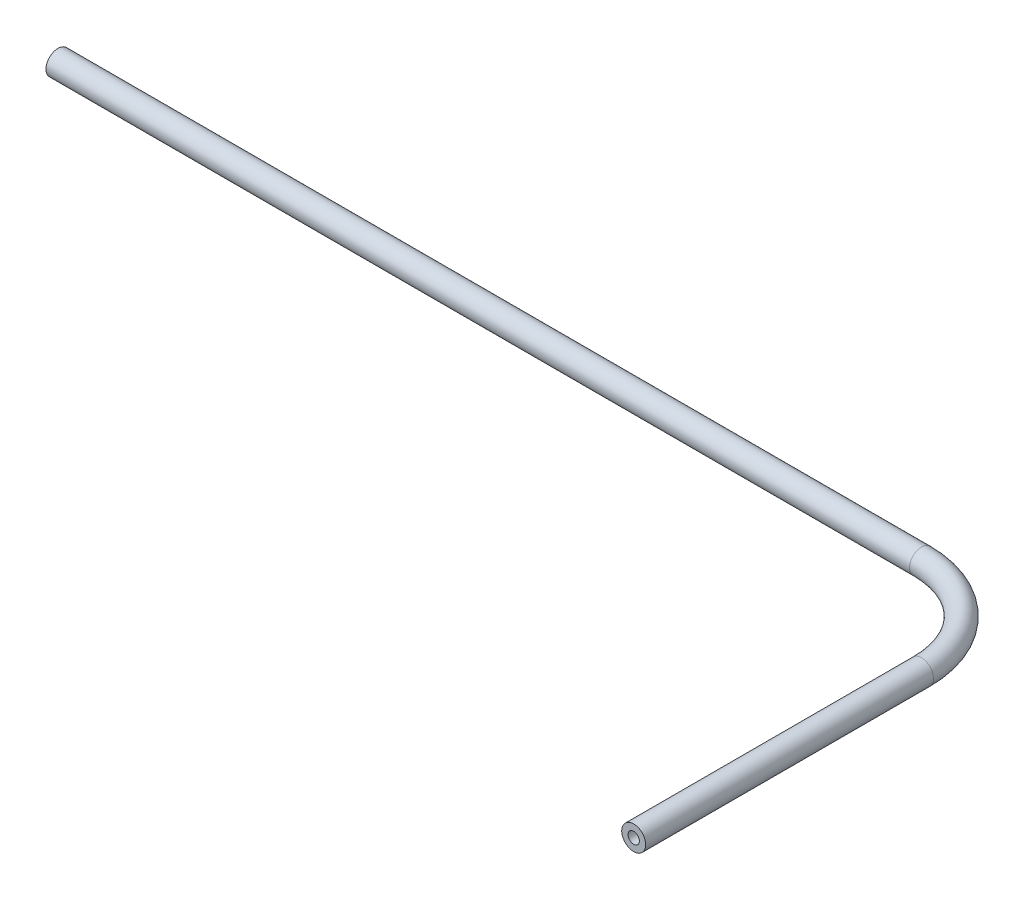
ISO-10303-21;
HEADER;
FILE_DESCRIPTION(('STEP AP214'),'2;1');
FILE_NAME('part.step','',(''),(''),'','','');
FILE_SCHEMA(('AUTOMOTIVE_DESIGN { 1 0 10303 214 1 1 1 1 }'));
ENDSEC;
DATA;
#1=APPLICATION_CONTEXT('core data for automotive mechanical design processes');
#2=APPLICATION_PROTOCOL_DEFINITION('international standard','automotive_design',2000,#1);
#3=PRODUCT_CONTEXT('',#1,'mechanical');
#4=PRODUCT('Part','Part','',(#3));
#5=PRODUCT_RELATED_PRODUCT_CATEGORY('part','',(#4));
#6=PRODUCT_DEFINITION_FORMATION('','',#4);
#7=PRODUCT_DEFINITION_CONTEXT('part definition',#1,'design');
#8=PRODUCT_DEFINITION('design','',#6,#7);
#9=PRODUCT_DEFINITION_SHAPE('','',#8);
#10=(LENGTH_UNIT() NAMED_UNIT(*) SI_UNIT(.MILLI.,.METRE.));
#11=(NAMED_UNIT(*) PLANE_ANGLE_UNIT() SI_UNIT($,.RADIAN.));
#12=(NAMED_UNIT(*) SI_UNIT($,.STERADIAN.) SOLID_ANGLE_UNIT());
#13=UNCERTAINTY_MEASURE_WITH_UNIT(LENGTH_MEASURE(1.E-05),#10,'distance_accuracy_value','');
#14=(GEOMETRIC_REPRESENTATION_CONTEXT(3) GLOBAL_UNCERTAINTY_ASSIGNED_CONTEXT((#13)) GLOBAL_UNIT_ASSIGNED_CONTEXT((#10,
#11,#12)) REPRESENTATION_CONTEXT('',''));
#15=CARTESIAN_POINT('',(0.,0.,0.));
#16=DIRECTION('',(0.,0.,1.));
#17=DIRECTION('',(1.,0.,0.));
#18=AXIS2_PLACEMENT_3D('',#15,#16,#17);
#19=CARTESIAN_POINT('',(-254.,0.,0.));
#20=DIRECTION('',(1.,0.,0.));
#21=DIRECTION('',(0.,0.,-1.));
#22=AXIS2_PLACEMENT_3D('',#19,#20,#21);
#23=CYLINDRICAL_SURFACE('',#22,3.175);
#24=CARTESIAN_POINT('',(-25.4,0.,0.));
#25=DIRECTION('',(1.,0.,0.));
#26=DIRECTION('',(0.,0.,-1.));
#27=AXIS2_PLACEMENT_3D('',#24,#25,#26);
#28=CIRCLE('',#27,3.175);
#29=CARTESIAN_POINT('',(-25.4,0.,-3.17500000000004));
#30=VERTEX_POINT('',#29);
#31=EDGE_CURVE('E64',#30,#30,#28,.T.);
#32=ORIENTED_EDGE('',*,*,#31,.F.);
#33=EDGE_LOOP('',(#32));
#34=FACE_BOUND('',#33,.T.);
#35=CARTESIAN_POINT('',(-254.,0.,0.));
#36=DIRECTION('',(1.,0.,0.));
#37=DIRECTION('',(0.,0.,-1.));
#38=AXIS2_PLACEMENT_3D('',#35,#36,#37);
#39=CIRCLE('',#38,3.175);
#40=CARTESIAN_POINT('',(-254.,0.,-3.175));
#41=VERTEX_POINT('',#40);
#42=EDGE_CURVE('E61',#41,#41,#39,.T.);
#43=ORIENTED_EDGE('',*,*,#42,.T.);
#44=EDGE_LOOP('',(#43));
#45=FACE_BOUND('',#44,.T.);
#46=ADVANCED_FACE('F37',(#34,#45),#23,.T.);
#47=CARTESIAN_POINT('',(-25.4,0.,25.4));
#48=DIRECTION('',(0.,-1.,0.));
#49=DIRECTION('',(0.,0.,-1.));
#50=AXIS2_PLACEMENT_3D('',#47,#48,#49);
#51=TOROIDAL_SURFACE('',#50,25.4,3.175);
#52=CARTESIAN_POINT('',(0.,0.,25.4));
#53=DIRECTION('',(0.,0.,1.));
#54=DIRECTION('',(1.,0.,0.));
#55=AXIS2_PLACEMENT_3D('',#52,#53,#54);
#56=CIRCLE('',#55,3.175);
#57=CARTESIAN_POINT('',(3.17500000000003,0.,25.4));
#58=VERTEX_POINT('',#57);
#59=EDGE_CURVE('E41',#58,#58,#56,.T.);
#60=CARTESIAN_POINT('',(-25.4,0.,25.4));
#61=DIRECTION('',(0.,-1.,0.));
#62=DIRECTION('',(0.,0.,-1.));
#63=AXIS2_PLACEMENT_3D('',#60,#61,#62);
#64=CIRCLE('',#63,28.575);
#65=EDGE_CURVE('',#30,#58,#64,.T.);
#66=ORIENTED_EDGE('',*,*,#31,.T.);
#67=ORIENTED_EDGE('',*,*,#59,.F.);
#68=ORIENTED_EDGE('',*,*,#65,.T.);
#69=ORIENTED_EDGE('',*,*,#65,.F.);
#70=EDGE_LOOP('',(#66,#68,#67,#69));
#71=FACE_BOUND('',#70,.T.);
#72=ADVANCED_FACE('F74',(#71),#51,.T.);
#73=CARTESIAN_POINT('',(0.,0.,25.4));
#74=DIRECTION('',(0.,0.,1.));
#75=DIRECTION('',(1.,0.,0.));
#76=AXIS2_PLACEMENT_3D('',#73,#74,#75);
#77=CYLINDRICAL_SURFACE('',#76,3.175);
#78=CARTESIAN_POINT('',(0.,0.,101.6));
#79=DIRECTION('',(0.,0.,1.));
#80=DIRECTION('',(1.,0.,0.));
#81=AXIS2_PLACEMENT_3D('',#78,#79,#80);
#82=CIRCLE('',#81,3.175);
#83=CARTESIAN_POINT('',(3.17500000000001,0.,101.6));
#84=VERTEX_POINT('',#83);
#85=EDGE_CURVE('E56',#84,#84,#82,.T.);
#86=ORIENTED_EDGE('',*,*,#85,.F.);
#87=EDGE_LOOP('',(#86));
#88=FACE_BOUND('',#87,.T.);
#89=ORIENTED_EDGE('',*,*,#59,.T.);
#90=EDGE_LOOP('',(#89));
#91=FACE_BOUND('',#90,.T.);
#92=ADVANCED_FACE('F39',(#88,#91),#77,.T.);
#93=CARTESIAN_POINT('',(-254.,0.,0.));
#94=DIRECTION('',(1.,0.,0.));
#95=DIRECTION('',(0.,0.,-1.));
#96=AXIS2_PLACEMENT_3D('',#93,#94,#95);
#97=PLANE('',#96);
#98=CARTESIAN_POINT('',(-254.,0.,0.));
#99=DIRECTION('',(1.,0.,0.));
#100=DIRECTION('',(0.,0.,-1.));
#101=AXIS2_PLACEMENT_3D('',#98,#99,#100);
#102=CIRCLE('',#101,1.5);
#103=CARTESIAN_POINT('',(-254.,0.,-1.5));
#104=VERTEX_POINT('',#103);
#105=EDGE_CURVE('E60',#104,#104,#102,.F.);
#106=ORIENTED_EDGE('',*,*,#105,.F.);
#107=EDGE_LOOP('',(#106));
#108=FACE_BOUND('',#107,.T.);
#109=ORIENTED_EDGE('',*,*,#42,.F.);
#110=EDGE_LOOP('',(#109));
#111=FACE_BOUND('',#110,.T.);
#112=ADVANCED_FACE('F80',(#108,#111),#97,.F.);
#113=CARTESIAN_POINT('',(0.,0.,101.6));
#114=DIRECTION('',(0.,0.,1.));
#115=DIRECTION('',(1.,0.,0.));
#116=AXIS2_PLACEMENT_3D('',#113,#114,#115);
#117=PLANE('',#116);
#118=CARTESIAN_POINT('',(0.,0.,101.6));
#119=DIRECTION('',(0.,0.,1.));
#120=DIRECTION('',(1.,0.,0.));
#121=AXIS2_PLACEMENT_3D('',#118,#119,#120);
#122=CIRCLE('',#121,1.5);
#123=CARTESIAN_POINT('',(1.50000000000001,0.,101.6));
#124=VERTEX_POINT('',#123);
#125=EDGE_CURVE('E10',#124,#124,#122,.F.);
#126=ORIENTED_EDGE('',*,*,#125,.T.);
#127=EDGE_LOOP('',(#126));
#128=FACE_BOUND('',#127,.T.);
#129=ORIENTED_EDGE('',*,*,#85,.T.);
#130=EDGE_LOOP('',(#129));
#131=FACE_BOUND('',#130,.T.);
#132=ADVANCED_FACE('F98',(#128,#131),#117,.T.);
#133=CARTESIAN_POINT('',(-254.,0.,0.));
#134=DIRECTION('',(1.,0.,0.));
#135=DIRECTION('',(0.,0.,-1.));
#136=AXIS2_PLACEMENT_3D('',#133,#134,#135);
#137=CYLINDRICAL_SURFACE('',#136,1.5);
#138=CARTESIAN_POINT('',(-25.4,0.,0.));
#139=DIRECTION('',(1.,0.,0.));
#140=DIRECTION('',(0.,0.,-1.));
#141=AXIS2_PLACEMENT_3D('',#138,#139,#140);
#142=CIRCLE('',#141,1.5);
#143=CARTESIAN_POINT('',(-25.4,0.,-1.50000000000004));
#144=VERTEX_POINT('',#143);
#145=EDGE_CURVE('E52',#144,#144,#142,.F.);
#146=ORIENTED_EDGE('',*,*,#145,.F.);
#147=EDGE_LOOP('',(#146));
#148=FACE_BOUND('',#147,.T.);
#149=ORIENTED_EDGE('',*,*,#105,.T.);
#150=EDGE_LOOP('',(#149));
#151=FACE_BOUND('',#150,.T.);
#152=ADVANCED_FACE('F92',(#148,#151),#137,.F.);
#153=CARTESIAN_POINT('',(-25.4,0.,25.4));
#154=DIRECTION('',(0.,-1.,0.));
#155=DIRECTION('',(0.,0.,-1.));
#156=AXIS2_PLACEMENT_3D('',#153,#154,#155);
#157=TOROIDAL_SURFACE('',#156,25.4,1.5);
#158=CARTESIAN_POINT('',(0.,0.,25.4));
#159=DIRECTION('',(0.,0.,1.));
#160=DIRECTION('',(1.,0.,0.));
#161=AXIS2_PLACEMENT_3D('',#158,#159,#160);
#162=CIRCLE('',#161,1.5);
#163=CARTESIAN_POINT('',(1.50000000000003,0.,25.4));
#164=VERTEX_POINT('',#163);
#165=EDGE_CURVE('E46',#164,#164,#162,.F.);
#166=CARTESIAN_POINT('',(-25.4,0.,25.4));
#167=DIRECTION('',(0.,-1.,0.));
#168=DIRECTION('',(0.,0.,-1.));
#169=AXIS2_PLACEMENT_3D('',#166,#167,#168);
#170=CIRCLE('',#169,26.9);
#171=EDGE_CURVE('',#144,#164,#170,.T.);
#172=ORIENTED_EDGE('',*,*,#145,.T.);
#173=ORIENTED_EDGE('',*,*,#165,.F.);
#174=ORIENTED_EDGE('',*,*,#171,.T.);
#175=ORIENTED_EDGE('',*,*,#171,.F.);
#176=EDGE_LOOP('',(#172,#174,#173,#175));
#177=FACE_BOUND('',#176,.T.);
#178=ADVANCED_FACE('F86',(#177),#157,.F.);
#179=CARTESIAN_POINT('',(0.,0.,25.4));
#180=DIRECTION('',(0.,0.,1.));
#181=DIRECTION('',(1.,0.,0.));
#182=AXIS2_PLACEMENT_3D('',#179,#180,#181);
#183=CYLINDRICAL_SURFACE('',#182,1.5);
#184=ORIENTED_EDGE('',*,*,#125,.F.);
#185=EDGE_LOOP('',(#184));
#186=FACE_BOUND('',#185,.T.);
#187=ORIENTED_EDGE('',*,*,#165,.T.);
#188=EDGE_LOOP('',(#187));
#189=FACE_BOUND('',#188,.T.);
#190=ADVANCED_FACE('F84',(#186,#189),#183,.F.);
#191=CLOSED_SHELL('',(#46,#72,#92,#112,#132,#152,#178,#190));
#192=MANIFOLD_SOLID_BREP('B2',#191);
#193=ADVANCED_BREP_SHAPE_REPRESENTATION('',(#18,#192),#14);
#194=SHAPE_DEFINITION_REPRESENTATION(#9,#193);
ENDSEC;
END-ISO-10303-21;
